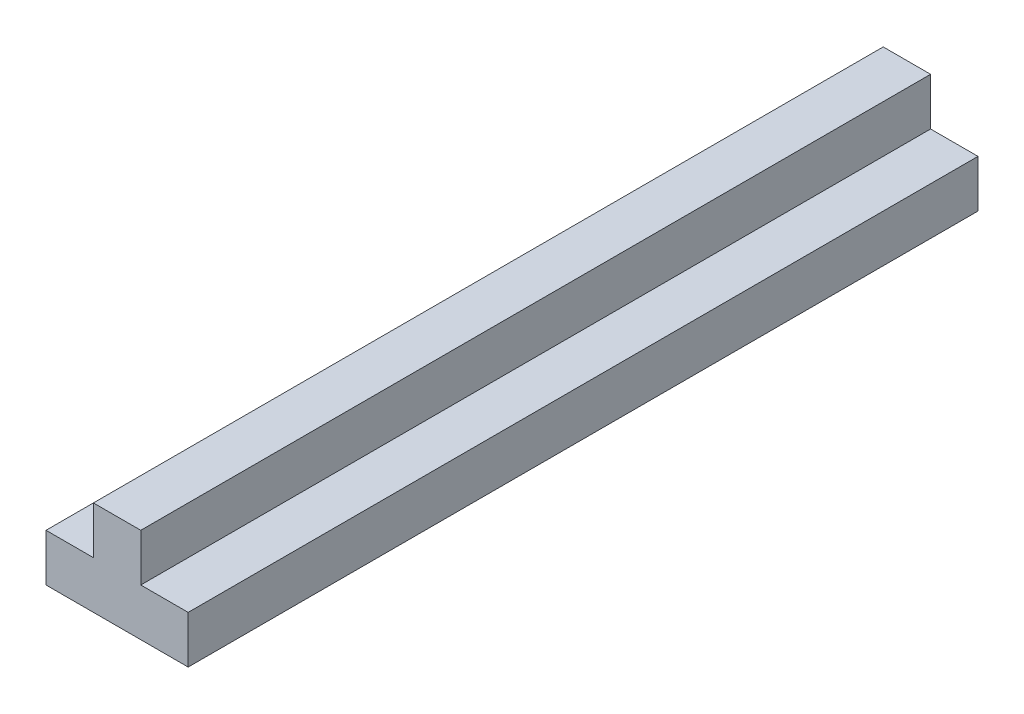
ISO-10303-21;
HEADER;
FILE_DESCRIPTION(('STEP AP214'),'2;1');
FILE_NAME('part.step','',(''),(''),'','','');
FILE_SCHEMA(('AUTOMOTIVE_DESIGN { 1 0 10303 214 1 1 1 1 }'));
ENDSEC;
DATA;
#1=APPLICATION_CONTEXT('core data for automotive mechanical design processes');
#2=APPLICATION_PROTOCOL_DEFINITION('international standard','automotive_design',2000,#1);
#3=PRODUCT_CONTEXT('',#1,'mechanical');
#4=PRODUCT('Part','Part','',(#3));
#5=PRODUCT_RELATED_PRODUCT_CATEGORY('part','',(#4));
#6=PRODUCT_DEFINITION_FORMATION('','',#4);
#7=PRODUCT_DEFINITION_CONTEXT('part definition',#1,'design');
#8=PRODUCT_DEFINITION('design','',#6,#7);
#9=PRODUCT_DEFINITION_SHAPE('','',#8);
#10=(LENGTH_UNIT() NAMED_UNIT(*) SI_UNIT(.MILLI.,.METRE.));
#11=(NAMED_UNIT(*) PLANE_ANGLE_UNIT() SI_UNIT($,.RADIAN.));
#12=(NAMED_UNIT(*) SI_UNIT($,.STERADIAN.) SOLID_ANGLE_UNIT());
#13=UNCERTAINTY_MEASURE_WITH_UNIT(LENGTH_MEASURE(1.E-05),#10,'distance_accuracy_value','');
#14=(GEOMETRIC_REPRESENTATION_CONTEXT(3) GLOBAL_UNCERTAINTY_ASSIGNED_CONTEXT((#13)) GLOBAL_UNIT_ASSIGNED_CONTEXT((#10,
#11,#12)) REPRESENTATION_CONTEXT('',''));
#15=CARTESIAN_POINT('',(0.,0.,0.));
#16=DIRECTION('',(0.,0.,1.));
#17=DIRECTION('',(1.,0.,0.));
#18=AXIS2_PLACEMENT_3D('',#15,#16,#17);
#19=CARTESIAN_POINT('',(0.,0.,50.));
#20=DIRECTION('',(0.,1.,0.));
#21=DIRECTION('',(0.,0.,1.));
#22=AXIS2_PLACEMENT_3D('',#19,#20,#21);
#23=PLANE('',#22);
#24=DIRECTION('',(1.,0.,0.));
#25=VECTOR('',#24,1.);
#26=CARTESIAN_POINT('',(0.,0.,0.));
#27=LINE('',#26,#25);
#28=CARTESIAN_POINT('',(-4.5,0.,0.));
#29=VERTEX_POINT('',#28);
#30=CARTESIAN_POINT('',(4.5,0.,0.));
#31=VERTEX_POINT('',#30);
#32=EDGE_CURVE('E85',#29,#31,#27,.T.);
#33=ORIENTED_EDGE('',*,*,#32,.T.);
#34=DIRECTION('',(0.,0.,-1.));
#35=VECTOR('',#34,1.);
#36=CARTESIAN_POINT('',(4.5,0.,50.));
#37=LINE('',#36,#35);
#38=CARTESIAN_POINT('',(4.5,0.,50.));
#39=VERTEX_POINT('',#38);
#40=EDGE_CURVE('E11',#39,#31,#37,.T.);
#41=ORIENTED_EDGE('',*,*,#40,.F.);
#42=DIRECTION('',(1.,0.,0.));
#43=VECTOR('',#42,1.);
#44=CARTESIAN_POINT('',(-4.5,0.,50.));
#45=LINE('',#44,#43);
#46=CARTESIAN_POINT('',(-4.5,0.,50.));
#47=VERTEX_POINT('',#46);
#48=EDGE_CURVE('E91',#47,#39,#45,.T.);
#49=ORIENTED_EDGE('',*,*,#48,.F.);
#50=DIRECTION('',(0.,0.,-1.));
#51=VECTOR('',#50,1.);
#52=CARTESIAN_POINT('',(-4.5,0.,50.));
#53=LINE('',#52,#51);
#54=EDGE_CURVE('E125',#47,#29,#53,.T.);
#55=ORIENTED_EDGE('',*,*,#54,.T.);
#56=EDGE_LOOP('',(#33,#41,#49,#55));
#57=FACE_BOUND('',#56,.T.);
#58=ADVANCED_FACE('F33',(#57),#23,.F.);
#59=CARTESIAN_POINT('',(4.5,0.,50.));
#60=DIRECTION('',(-1.,0.,0.));
#61=DIRECTION('',(0.,0.,1.));
#62=AXIS2_PLACEMENT_3D('',#59,#60,#61);
#63=PLANE('',#62);
#64=DIRECTION('',(0.,1.,0.));
#65=VECTOR('',#64,1.);
#66=CARTESIAN_POINT('',(4.5,0.,0.));
#67=LINE('',#66,#65);
#68=CARTESIAN_POINT('',(4.5,3.,0.));
#69=VERTEX_POINT('',#68);
#70=EDGE_CURVE('E130',#31,#69,#67,.T.);
#71=ORIENTED_EDGE('',*,*,#70,.T.);
#72=DIRECTION('',(0.,0.,-1.));
#73=VECTOR('',#72,1.);
#74=CARTESIAN_POINT('',(4.5,3.,50.));
#75=LINE('',#74,#73);
#76=CARTESIAN_POINT('',(4.5,3.,50.));
#77=VERTEX_POINT('',#76);
#78=EDGE_CURVE('E41',#77,#69,#75,.T.);
#79=ORIENTED_EDGE('',*,*,#78,.F.);
#80=DIRECTION('',(0.,1.,0.));
#81=VECTOR('',#80,1.);
#82=CARTESIAN_POINT('',(4.5,0.,50.));
#83=LINE('',#82,#81);
#84=EDGE_CURVE('E174',#39,#77,#83,.T.);
#85=ORIENTED_EDGE('',*,*,#84,.F.);
#86=ORIENTED_EDGE('',*,*,#40,.T.);
#87=EDGE_LOOP('',(#71,#79,#85,#86));
#88=FACE_BOUND('',#87,.T.);
#89=ADVANCED_FACE('F176',(#88),#63,.F.);
#90=CARTESIAN_POINT('',(4.5,3.,50.));
#91=DIRECTION('',(0.,-1.,0.));
#92=DIRECTION('',(1.,0.,0.));
#93=AXIS2_PLACEMENT_3D('',#90,#91,#92);
#94=PLANE('',#93);
#95=DIRECTION('',(-1.,0.,0.));
#96=VECTOR('',#95,1.);
#97=CARTESIAN_POINT('',(4.5,3.,0.));
#98=LINE('',#97,#96);
#99=CARTESIAN_POINT('',(1.5,3.,0.));
#100=VERTEX_POINT('',#99);
#101=EDGE_CURVE('E132',#69,#100,#98,.T.);
#102=ORIENTED_EDGE('',*,*,#101,.T.);
#103=DIRECTION('',(0.,0.,-1.));
#104=VECTOR('',#103,1.);
#105=CARTESIAN_POINT('',(1.5,3.,50.));
#106=LINE('',#105,#104);
#107=CARTESIAN_POINT('',(1.5,3.,50.));
#108=VERTEX_POINT('',#107);
#109=EDGE_CURVE('E149',#108,#100,#106,.T.);
#110=ORIENTED_EDGE('',*,*,#109,.F.);
#111=DIRECTION('',(-1.,0.,0.));
#112=VECTOR('',#111,1.);
#113=CARTESIAN_POINT('',(4.5,3.,50.));
#114=LINE('',#113,#112);
#115=EDGE_CURVE('E158',#77,#108,#114,.T.);
#116=ORIENTED_EDGE('',*,*,#115,.F.);
#117=ORIENTED_EDGE('',*,*,#78,.T.);
#118=EDGE_LOOP('',(#102,#110,#116,#117));
#119=FACE_BOUND('',#118,.T.);
#120=ADVANCED_FACE('F156',(#119),#94,.F.);
#121=CARTESIAN_POINT('',(1.5,3.,50.));
#122=DIRECTION('',(-1.,0.,0.));
#123=DIRECTION('',(0.,-1.,0.));
#124=AXIS2_PLACEMENT_3D('',#121,#122,#123);
#125=PLANE('',#124);
#126=DIRECTION('',(0.,1.,0.));
#127=VECTOR('',#126,1.);
#128=CARTESIAN_POINT('',(1.5,3.,0.));
#129=LINE('',#128,#127);
#130=CARTESIAN_POINT('',(1.5,6.,0.));
#131=VERTEX_POINT('',#130);
#132=EDGE_CURVE('E134',#100,#131,#129,.T.);
#133=ORIENTED_EDGE('',*,*,#132,.T.);
#134=DIRECTION('',(0.,0.,-1.));
#135=VECTOR('',#134,1.);
#136=CARTESIAN_POINT('',(1.5,6.,50.));
#137=LINE('',#136,#135);
#138=CARTESIAN_POINT('',(1.5,6.,50.));
#139=VERTEX_POINT('',#138);
#140=EDGE_CURVE('E146',#139,#131,#137,.T.);
#141=ORIENTED_EDGE('',*,*,#140,.F.);
#142=DIRECTION('',(0.,1.,0.));
#143=VECTOR('',#142,1.);
#144=CARTESIAN_POINT('',(1.5,3.,50.));
#145=LINE('',#144,#143);
#146=EDGE_CURVE('E170',#108,#139,#145,.T.);
#147=ORIENTED_EDGE('',*,*,#146,.F.);
#148=ORIENTED_EDGE('',*,*,#109,.T.);
#149=EDGE_LOOP('',(#133,#141,#147,#148));
#150=FACE_BOUND('',#149,.T.);
#151=ADVANCED_FACE('F166',(#150),#125,.F.);
#152=CARTESIAN_POINT('',(1.5,6.,50.));
#153=DIRECTION('',(0.,-1.,0.));
#154=DIRECTION('',(0.,0.,-1.));
#155=AXIS2_PLACEMENT_3D('',#152,#153,#154);
#156=PLANE('',#155);
#157=DIRECTION('',(-1.,0.,0.));
#158=VECTOR('',#157,1.);
#159=CARTESIAN_POINT('',(1.5,6.,0.));
#160=LINE('',#159,#158);
#161=CARTESIAN_POINT('',(-1.5,6.,0.));
#162=VERTEX_POINT('',#161);
#163=EDGE_CURVE('E136',#131,#162,#160,.T.);
#164=ORIENTED_EDGE('',*,*,#163,.T.);
#165=DIRECTION('',(0.,0.,-1.));
#166=VECTOR('',#165,1.);
#167=CARTESIAN_POINT('',(-1.5,6.,50.));
#168=LINE('',#167,#166);
#169=CARTESIAN_POINT('',(-1.5,6.,50.));
#170=VERTEX_POINT('',#169);
#171=EDGE_CURVE('E120',#170,#162,#168,.T.);
#172=ORIENTED_EDGE('',*,*,#171,.F.);
#173=DIRECTION('',(-1.,0.,0.));
#174=VECTOR('',#173,1.);
#175=CARTESIAN_POINT('',(1.5,6.,50.));
#176=LINE('',#175,#174);
#177=EDGE_CURVE('E111',#139,#170,#176,.T.);
#178=ORIENTED_EDGE('',*,*,#177,.F.);
#179=ORIENTED_EDGE('',*,*,#140,.T.);
#180=EDGE_LOOP('',(#164,#172,#178,#179));
#181=FACE_BOUND('',#180,.T.);
#182=ADVANCED_FACE('F169',(#181),#156,.F.);
#183=CARTESIAN_POINT('',(-1.5,6.,50.));
#184=DIRECTION('',(1.,0.,0.));
#185=DIRECTION('',(0.,1.,0.));
#186=AXIS2_PLACEMENT_3D('',#183,#184,#185);
#187=PLANE('',#186);
#188=DIRECTION('',(0.,-1.,0.));
#189=VECTOR('',#188,1.);
#190=CARTESIAN_POINT('',(-1.5,6.,0.));
#191=LINE('',#190,#189);
#192=CARTESIAN_POINT('',(-1.5,3.,0.));
#193=VERTEX_POINT('',#192);
#194=EDGE_CURVE('E119',#162,#193,#191,.T.);
#195=ORIENTED_EDGE('',*,*,#194,.T.);
#196=DIRECTION('',(0.,0.,-1.));
#197=VECTOR('',#196,1.);
#198=CARTESIAN_POINT('',(-1.5,3.,50.));
#199=LINE('',#198,#197);
#200=CARTESIAN_POINT('',(-1.5,3.,50.));
#201=VERTEX_POINT('',#200);
#202=EDGE_CURVE('E116',#201,#193,#199,.T.);
#203=ORIENTED_EDGE('',*,*,#202,.F.);
#204=DIRECTION('',(0.,-1.,0.));
#205=VECTOR('',#204,1.);
#206=CARTESIAN_POINT('',(-1.5,6.,50.));
#207=LINE('',#206,#205);
#208=EDGE_CURVE('E105',#170,#201,#207,.T.);
#209=ORIENTED_EDGE('',*,*,#208,.F.);
#210=ORIENTED_EDGE('',*,*,#171,.T.);
#211=EDGE_LOOP('',(#195,#203,#209,#210));
#212=FACE_BOUND('',#211,.T.);
#213=ADVANCED_FACE('F117',(#212),#187,.F.);
#214=CARTESIAN_POINT('',(-1.5,3.,50.));
#215=DIRECTION('',(0.,-1.,0.));
#216=DIRECTION('',(0.,0.,-1.));
#217=AXIS2_PLACEMENT_3D('',#214,#215,#216);
#218=PLANE('',#217);
#219=DIRECTION('',(-1.,0.,0.));
#220=VECTOR('',#219,1.);
#221=CARTESIAN_POINT('',(-1.5,3.,0.));
#222=LINE('',#221,#220);
#223=CARTESIAN_POINT('',(-4.5,3.,0.));
#224=VERTEX_POINT('',#223);
#225=EDGE_CURVE('E78',#193,#224,#222,.T.);
#226=ORIENTED_EDGE('',*,*,#225,.T.);
#227=DIRECTION('',(0.,0.,-1.));
#228=VECTOR('',#227,1.);
#229=CARTESIAN_POINT('',(-4.5,3.,50.));
#230=LINE('',#229,#228);
#231=CARTESIAN_POINT('',(-4.5,3.,50.));
#232=VERTEX_POINT('',#231);
#233=EDGE_CURVE('E121',#232,#224,#230,.T.);
#234=ORIENTED_EDGE('',*,*,#233,.F.);
#235=DIRECTION('',(-1.,0.,0.));
#236=VECTOR('',#235,1.);
#237=CARTESIAN_POINT('',(-1.5,3.,50.));
#238=LINE('',#237,#236);
#239=EDGE_CURVE('E109',#201,#232,#238,.T.);
#240=ORIENTED_EDGE('',*,*,#239,.F.);
#241=ORIENTED_EDGE('',*,*,#202,.T.);
#242=EDGE_LOOP('',(#226,#234,#240,#241));
#243=FACE_BOUND('',#242,.T.);
#244=ADVANCED_FACE('F123',(#243),#218,.F.);
#245=CARTESIAN_POINT('',(-4.5,3.,50.));
#246=DIRECTION('',(1.,0.,0.));
#247=DIRECTION('',(0.,0.,-1.));
#248=AXIS2_PLACEMENT_3D('',#245,#246,#247);
#249=PLANE('',#248);
#250=DIRECTION('',(0.,-1.,0.));
#251=VECTOR('',#250,1.);
#252=CARTESIAN_POINT('',(-4.5,3.,0.));
#253=LINE('',#252,#251);
#254=EDGE_CURVE('E140',#224,#29,#253,.T.);
#255=ORIENTED_EDGE('',*,*,#254,.T.);
#256=ORIENTED_EDGE('',*,*,#54,.F.);
#257=DIRECTION('',(0.,-1.,0.));
#258=VECTOR('',#257,1.);
#259=CARTESIAN_POINT('',(-4.5,3.,50.));
#260=LINE('',#259,#258);
#261=EDGE_CURVE('E49',#232,#47,#260,.T.);
#262=ORIENTED_EDGE('',*,*,#261,.F.);
#263=ORIENTED_EDGE('',*,*,#233,.T.);
#264=EDGE_LOOP('',(#255,#256,#262,#263));
#265=FACE_BOUND('',#264,.T.);
#266=ADVANCED_FACE('F179',(#265),#249,.F.);
#267=CARTESIAN_POINT('',(0.,0.,50.));
#268=DIRECTION('',(0.,0.,1.));
#269=DIRECTION('',(1.,0.,0.));
#270=AXIS2_PLACEMENT_3D('',#267,#268,#269);
#271=PLANE('',#270);
#272=ORIENTED_EDGE('',*,*,#48,.T.);
#273=ORIENTED_EDGE('',*,*,#84,.T.);
#274=ORIENTED_EDGE('',*,*,#115,.T.);
#275=ORIENTED_EDGE('',*,*,#146,.T.);
#276=ORIENTED_EDGE('',*,*,#177,.T.);
#277=ORIENTED_EDGE('',*,*,#208,.T.);
#278=ORIENTED_EDGE('',*,*,#239,.T.);
#279=ORIENTED_EDGE('',*,*,#261,.T.);
#280=EDGE_LOOP('',(#272,#273,#274,#275,#276,#277,#278,#279));
#281=FACE_BOUND('',#280,.T.);
#282=ADVANCED_FACE('F107',(#281),#271,.T.);
#283=CARTESIAN_POINT('',(0.,0.,0.));
#284=DIRECTION('',(0.,0.,1.));
#285=DIRECTION('',(1.,0.,0.));
#286=AXIS2_PLACEMENT_3D('',#283,#284,#285);
#287=PLANE('',#286);
#288=ORIENTED_EDGE('',*,*,#32,.F.);
#289=ORIENTED_EDGE('',*,*,#254,.F.);
#290=ORIENTED_EDGE('',*,*,#225,.F.);
#291=ORIENTED_EDGE('',*,*,#194,.F.);
#292=ORIENTED_EDGE('',*,*,#163,.F.);
#293=ORIENTED_EDGE('',*,*,#132,.F.);
#294=ORIENTED_EDGE('',*,*,#101,.F.);
#295=ORIENTED_EDGE('',*,*,#70,.F.);
#296=EDGE_LOOP('',(#288,#289,#290,#291,#292,#293,#294,#295));
#297=FACE_BOUND('',#296,.T.);
#298=ADVANCED_FACE('F162',(#297),#287,.F.);
#299=CLOSED_SHELL('',(#58,#89,#120,#151,#182,#213,#244,#266,#282,#298));
#300=MANIFOLD_SOLID_BREP('B2',#299);
#301=ADVANCED_BREP_SHAPE_REPRESENTATION('',(#18,#300),#14);
#302=SHAPE_DEFINITION_REPRESENTATION(#9,#301);
ENDSEC;
END-ISO-10303-21;
